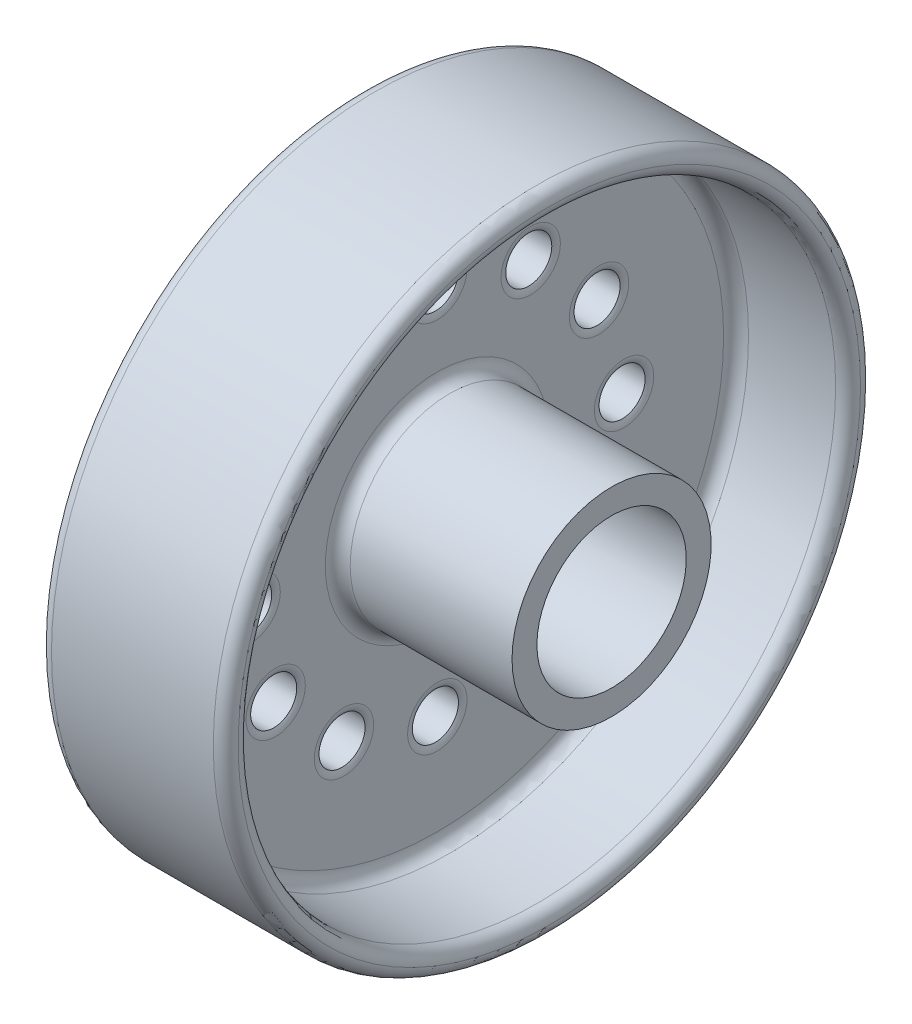
ISO-10303-21;
HEADER;
FILE_DESCRIPTION(('STEP AP214'),'2;1');
FILE_NAME('part.step','',(''),(''),'','','');
FILE_SCHEMA(('AUTOMOTIVE_DESIGN { 1 0 10303 214 1 1 1 1 }'));
ENDSEC;
DATA;
#1=APPLICATION_CONTEXT('core data for automotive mechanical design processes');
#2=APPLICATION_PROTOCOL_DEFINITION('international standard','automotive_design',2000,#1);
#3=PRODUCT_CONTEXT('',#1,'mechanical');
#4=PRODUCT('Part','Part','',(#3));
#5=PRODUCT_RELATED_PRODUCT_CATEGORY('part','',(#4));
#6=PRODUCT_DEFINITION_FORMATION('','',#4);
#7=PRODUCT_DEFINITION_CONTEXT('part definition',#1,'design');
#8=PRODUCT_DEFINITION('design','',#6,#7);
#9=PRODUCT_DEFINITION_SHAPE('','',#8);
#10=(LENGTH_UNIT() NAMED_UNIT(*) SI_UNIT(.MILLI.,.METRE.));
#11=(NAMED_UNIT(*) PLANE_ANGLE_UNIT() SI_UNIT($,.RADIAN.));
#12=(NAMED_UNIT(*) SI_UNIT($,.STERADIAN.) SOLID_ANGLE_UNIT());
#13=UNCERTAINTY_MEASURE_WITH_UNIT(LENGTH_MEASURE(1.E-05),#10,'distance_accuracy_value','');
#14=(GEOMETRIC_REPRESENTATION_CONTEXT(3) GLOBAL_UNCERTAINTY_ASSIGNED_CONTEXT((#13)) GLOBAL_UNIT_ASSIGNED_CONTEXT((#10,
#11,#12)) REPRESENTATION_CONTEXT('',''));
#15=CARTESIAN_POINT('',(0.,0.,0.));
#16=DIRECTION('',(0.,0.,1.));
#17=DIRECTION('',(1.,0.,0.));
#18=AXIS2_PLACEMENT_3D('',#15,#16,#17);
#19=CARTESIAN_POINT('',(0.,0.,0.));
#20=DIRECTION('',(-1.,0.,0.));
#21=DIRECTION('',(0.,0.,1.));
#22=AXIS2_PLACEMENT_3D('',#19,#20,#21);
#23=CYLINDRICAL_SURFACE('',#22,130.);
#24=CARTESIAN_POINT('',(5.,0.,0.));
#25=DIRECTION('',(-1.,0.,0.));
#26=DIRECTION('',(0.,0.,1.));
#27=AXIS2_PLACEMENT_3D('',#24,#25,#26);
#28=CIRCLE('',#27,130.);
#29=CARTESIAN_POINT('',(5.,0.,130.));
#30=VERTEX_POINT('',#29);
#31=EDGE_CURVE('E10',#30,#30,#28,.F.);
#32=ORIENTED_EDGE('',*,*,#31,.T.);
#33=EDGE_LOOP('',(#32));
#34=FACE_BOUND('',#33,.T.);
#35=CARTESIAN_POINT('',(70.,0.,0.));
#36=DIRECTION('',(1.,0.,0.));
#37=DIRECTION('',(0.,0.,-1.));
#38=AXIS2_PLACEMENT_3D('',#35,#36,#37);
#39=CIRCLE('',#38,130.);
#40=CARTESIAN_POINT('',(70.,0.,-130.));
#41=VERTEX_POINT('',#40);
#42=EDGE_CURVE('E50',#41,#41,#39,.F.);
#43=ORIENTED_EDGE('',*,*,#42,.T.);
#44=EDGE_LOOP('',(#43));
#45=FACE_BOUND('',#44,.T.);
#46=ADVANCED_FACE('F41',(#34,#45),#23,.T.);
#47=CARTESIAN_POINT('',(0.,0.,0.));
#48=DIRECTION('',(-1.,0.,0.));
#49=DIRECTION('',(0.,0.,1.));
#50=AXIS2_PLACEMENT_3D('',#47,#48,#49);
#51=PLANE('',#50);
#52=CARTESIAN_POINT('',(0.,0.,0.));
#53=DIRECTION('',(-1.,0.,0.));
#54=DIRECTION('',(0.,0.,1.));
#55=AXIS2_PLACEMENT_3D('',#52,#53,#54);
#56=CIRCLE('',#55,125.);
#57=CARTESIAN_POINT('',(0.,0.,125.));
#58=VERTEX_POINT('',#57);
#59=EDGE_CURVE('E55',#58,#58,#56,.T.);
#60=ORIENTED_EDGE('',*,*,#59,.T.);
#61=EDGE_LOOP('',(#60));
#62=FACE_BOUND('',#61,.T.);
#63=CARTESIAN_POINT('',(0.,64.9519052838334,37.4999999999992));
#64=DIRECTION('',(1.,0.,0.));
#65=DIRECTION('',(0.,0.,-1.));
#66=AXIS2_PLACEMENT_3D('',#63,#64,#65);
#67=CIRCLE('',#66,9.24999999999999);
#68=CARTESIAN_POINT('',(0.,64.9519052838334,28.2499999999992));
#69=VERTEX_POINT('',#68);
#70=EDGE_CURVE('E229',#69,#69,#67,.T.);
#71=ORIENTED_EDGE('',*,*,#70,.T.);
#72=EDGE_LOOP('',(#71));
#73=FACE_BOUND('',#72,.T.);
#74=CARTESIAN_POINT('',(0.,37.5000000000008,64.9519052838325));
#75=DIRECTION('',(1.,0.,0.));
#76=DIRECTION('',(0.,0.,-1.));
#77=AXIS2_PLACEMENT_3D('',#74,#75,#76);
#78=CIRCLE('',#77,9.24999999999999);
#79=CARTESIAN_POINT('',(0.,37.5000000000008,55.7019052838325));
#80=VERTEX_POINT('',#79);
#81=EDGE_CURVE('E221',#80,#80,#78,.T.);
#82=ORIENTED_EDGE('',*,*,#81,.T.);
#83=EDGE_LOOP('',(#82));
#84=FACE_BOUND('',#83,.T.);
#85=CARTESIAN_POINT('',(0.,7.85583301239705E-13,75.));
#86=DIRECTION('',(1.,0.,0.));
#87=DIRECTION('',(0.,0.,-1.));
#88=AXIS2_PLACEMENT_3D('',#85,#86,#87);
#89=CIRCLE('',#88,9.24999999999999);
#90=CARTESIAN_POINT('',(0.,7.85583301239705E-13,65.75));
#91=VERTEX_POINT('',#90);
#92=EDGE_CURVE('E213',#91,#91,#89,.T.);
#93=ORIENTED_EDGE('',*,*,#92,.T.);
#94=EDGE_LOOP('',(#93));
#95=FACE_BOUND('',#94,.T.);
#96=CARTESIAN_POINT('',(0.,-37.4999999999994,64.9519052838332));
#97=DIRECTION('',(1.,0.,0.));
#98=DIRECTION('',(0.,0.,-1.));
#99=AXIS2_PLACEMENT_3D('',#96,#97,#98);
#100=CIRCLE('',#99,9.24999999999999);
#101=CARTESIAN_POINT('',(0.,-37.4999999999994,55.7019052838332));
#102=VERTEX_POINT('',#101);
#103=EDGE_CURVE('E205',#102,#102,#100,.T.);
#104=ORIENTED_EDGE('',*,*,#103,.T.);
#105=EDGE_LOOP('',(#104));
#106=FACE_BOUND('',#105,.T.);
#107=CARTESIAN_POINT('',(0.,-64.9519052838326,37.5000000000005));
#108=DIRECTION('',(1.,0.,0.));
#109=DIRECTION('',(0.,0.,-1.));
#110=AXIS2_PLACEMENT_3D('',#107,#108,#109);
#111=CIRCLE('',#110,9.24999999999999);
#112=CARTESIAN_POINT('',(0.,-64.9519052838326,28.2500000000005));
#113=VERTEX_POINT('',#112);
#114=EDGE_CURVE('E197',#113,#113,#111,.T.);
#115=ORIENTED_EDGE('',*,*,#114,.T.);
#116=EDGE_LOOP('',(#115));
#117=FACE_BOUND('',#116,.T.);
#118=CARTESIAN_POINT('',(0.,-75.,0.));
#119=DIRECTION('',(1.,0.,0.));
#120=DIRECTION('',(0.,0.,-1.));
#121=AXIS2_PLACEMENT_3D('',#118,#119,#120);
#122=CIRCLE('',#121,9.24999999999999);
#123=CARTESIAN_POINT('',(0.,-75.,-9.24999999999999));
#124=VERTEX_POINT('',#123);
#125=EDGE_CURVE('E189',#124,#124,#122,.T.);
#126=ORIENTED_EDGE('',*,*,#125,.T.);
#127=EDGE_LOOP('',(#126));
#128=FACE_BOUND('',#127,.T.);
#129=CARTESIAN_POINT('',(0.,-64.9519052838331,-37.4999999999996));
#130=DIRECTION('',(1.,0.,0.));
#131=DIRECTION('',(0.,0.,-1.));
#132=AXIS2_PLACEMENT_3D('',#129,#130,#131);
#133=CIRCLE('',#132,9.24999999999999);
#134=CARTESIAN_POINT('',(0.,-64.9519052838331,-46.7499999999996));
#135=VERTEX_POINT('',#134);
#136=EDGE_CURVE('E181',#135,#135,#133,.T.);
#137=ORIENTED_EDGE('',*,*,#136,.T.);
#138=EDGE_LOOP('',(#137));
#139=FACE_BOUND('',#138,.T.);
#140=CARTESIAN_POINT('',(0.,-37.5000000000003,-64.9519052838327));
#141=DIRECTION('',(1.,0.,0.));
#142=DIRECTION('',(0.,0.,-1.));
#143=AXIS2_PLACEMENT_3D('',#140,#141,#142);
#144=CIRCLE('',#143,9.24999999999999);
#145=CARTESIAN_POINT('',(0.,-37.5000000000003,-74.2019052838327));
#146=VERTEX_POINT('',#145);
#147=EDGE_CURVE('E173',#146,#146,#144,.T.);
#148=ORIENTED_EDGE('',*,*,#147,.T.);
#149=EDGE_LOOP('',(#148));
#150=FACE_BOUND('',#149,.T.);
#151=CARTESIAN_POINT('',(0.,-2.61861100413235E-13,-75.));
#152=DIRECTION('',(1.,0.,0.));
#153=DIRECTION('',(0.,0.,-1.));
#154=AXIS2_PLACEMENT_3D('',#151,#152,#153);
#155=CIRCLE('',#154,9.24999999999999);
#156=CARTESIAN_POINT('',(0.,-2.61861100413235E-13,-84.25));
#157=VERTEX_POINT('',#156);
#158=EDGE_CURVE('E165',#157,#157,#155,.T.);
#159=ORIENTED_EDGE('',*,*,#158,.T.);
#160=EDGE_LOOP('',(#159));
#161=FACE_BOUND('',#160,.T.);
#162=CARTESIAN_POINT('',(0.,37.4999999999998,-64.951905283833));
#163=DIRECTION('',(1.,0.,0.));
#164=DIRECTION('',(0.,0.,-1.));
#165=AXIS2_PLACEMENT_3D('',#162,#163,#164);
#166=CIRCLE('',#165,9.24999999999999);
#167=CARTESIAN_POINT('',(0.,37.4999999999998,-74.201905283833));
#168=VERTEX_POINT('',#167);
#169=EDGE_CURVE('E157',#168,#168,#166,.T.);
#170=ORIENTED_EDGE('',*,*,#169,.T.);
#171=EDGE_LOOP('',(#170));
#172=FACE_BOUND('',#171,.T.);
#173=CARTESIAN_POINT('',(0.,64.9519052838328,-37.5000000000001));
#174=DIRECTION('',(1.,0.,0.));
#175=DIRECTION('',(0.,0.,-1.));
#176=AXIS2_PLACEMENT_3D('',#173,#174,#175);
#177=CIRCLE('',#176,9.24999999999999);
#178=CARTESIAN_POINT('',(0.,64.9519052838328,-46.7500000000001));
#179=VERTEX_POINT('',#178);
#180=EDGE_CURVE('E149',#179,#179,#177,.T.);
#181=ORIENTED_EDGE('',*,*,#180,.T.);
#182=EDGE_LOOP('',(#181));
#183=FACE_BOUND('',#182,.T.);
#184=CARTESIAN_POINT('',(0.,75.,0.));
#185=DIRECTION('',(1.,0.,0.));
#186=DIRECTION('',(0.,0.,-1.));
#187=AXIS2_PLACEMENT_3D('',#184,#185,#186);
#188=CIRCLE('',#187,9.24999999999999);
#189=CARTESIAN_POINT('',(0.,75.,-9.24999999999999));
#190=VERTEX_POINT('',#189);
#191=EDGE_CURVE('E141',#190,#190,#188,.T.);
#192=ORIENTED_EDGE('',*,*,#191,.T.);
#193=EDGE_LOOP('',(#192));
#194=FACE_BOUND('',#193,.T.);
#195=CARTESIAN_POINT('',(0.,0.,0.));
#196=DIRECTION('',(-1.,0.,0.));
#197=DIRECTION('',(0.,0.,1.));
#198=AXIS2_PLACEMENT_3D('',#195,#196,#197);
#199=CIRCLE('',#198,30.);
#200=CARTESIAN_POINT('',(0.,0.,30.));
#201=VERTEX_POINT('',#200);
#202=EDGE_CURVE('E137',#201,#201,#199,.T.);
#203=ORIENTED_EDGE('',*,*,#202,.F.);
#204=EDGE_LOOP('',(#203));
#205=FACE_BOUND('',#204,.T.);
#206=ADVANCED_FACE('F256',(#62,#73,#84,#95,#106,#117,#128,#139,#150,#161,#172,#183,#194,#205),
#51,.T.);
#207=CARTESIAN_POINT('',(0.,0.,0.));
#208=DIRECTION('',(-1.,0.,0.));
#209=DIRECTION('',(0.,0.,1.));
#210=AXIS2_PLACEMENT_3D('',#207,#208,#209);
#211=CYLINDRICAL_SURFACE('',#210,30.);
#212=ORIENTED_EDGE('',*,*,#202,.T.);
#213=EDGE_LOOP('',(#212));
#214=FACE_BOUND('',#213,.T.);
#215=CARTESIAN_POINT('',(100.,0.,0.));
#216=DIRECTION('',(-1.,0.,0.));
#217=DIRECTION('',(0.,0.,1.));
#218=AXIS2_PLACEMENT_3D('',#215,#216,#217);
#219=CIRCLE('',#218,30.);
#220=CARTESIAN_POINT('',(100.,0.,30.));
#221=VERTEX_POINT('',#220);
#222=EDGE_CURVE('E129',#221,#221,#219,.T.);
#223=ORIENTED_EDGE('',*,*,#222,.F.);
#224=EDGE_LOOP('',(#223));
#225=FACE_BOUND('',#224,.T.);
#226=ADVANCED_FACE('F258',(#214,#225),#211,.F.);
#227=CARTESIAN_POINT('',(0.,0.,0.));
#228=DIRECTION('',(-1.,0.,0.));
#229=DIRECTION('',(0.,0.,1.));
#230=AXIS2_PLACEMENT_3D('',#227,#228,#229);
#231=CYLINDRICAL_SURFACE('',#230,120.);
#232=CARTESIAN_POINT('',(35.,0.,0.));
#233=DIRECTION('',(1.,0.,0.));
#234=DIRECTION('',(0.,0.,-1.));
#235=AXIS2_PLACEMENT_3D('',#232,#233,#234);
#236=CIRCLE('',#235,120.);
#237=CARTESIAN_POINT('',(35.,0.,-120.));
#238=VERTEX_POINT('',#237);
#239=EDGE_CURVE('E121',#238,#238,#236,.F.);
#240=ORIENTED_EDGE('',*,*,#239,.T.);
#241=EDGE_LOOP('',(#240));
#242=FACE_BOUND('',#241,.T.);
#243=CARTESIAN_POINT('',(70.,0.,0.));
#244=DIRECTION('',(1.,0.,0.));
#245=DIRECTION('',(0.,0.,-1.));
#246=AXIS2_PLACEMENT_3D('',#243,#244,#245);
#247=CIRCLE('',#246,120.);
#248=CARTESIAN_POINT('',(70.,0.,-120.));
#249=VERTEX_POINT('',#248);
#250=EDGE_CURVE('E125',#249,#249,#247,.T.);
#251=ORIENTED_EDGE('',*,*,#250,.T.);
#252=EDGE_LOOP('',(#251));
#253=FACE_BOUND('',#252,.T.);
#254=ADVANCED_FACE('F265',(#242,#253),#231,.F.);
#255=CARTESIAN_POINT('',(30.,0.,0.));
#256=DIRECTION('',(1.,0.,0.));
#257=DIRECTION('',(0.,0.,-1.));
#258=AXIS2_PLACEMENT_3D('',#255,#256,#257);
#259=PLANE('',#258);
#260=CARTESIAN_POINT('',(30.,0.,0.));
#261=DIRECTION('',(1.,0.,0.));
#262=DIRECTION('',(0.,0.,-1.));
#263=AXIS2_PLACEMENT_3D('',#260,#261,#262);
#264=CIRCLE('',#263,115.);
#265=CARTESIAN_POINT('',(30.,0.,-115.));
#266=VERTEX_POINT('',#265);
#267=EDGE_CURVE('E65',#266,#266,#264,.T.);
#268=ORIENTED_EDGE('',*,*,#267,.T.);
#269=EDGE_LOOP('',(#268));
#270=FACE_BOUND('',#269,.T.);
#271=CARTESIAN_POINT('',(30.,0.,0.));
#272=DIRECTION('',(1.,0.,0.));
#273=DIRECTION('',(0.,0.,-1.));
#274=AXIS2_PLACEMENT_3D('',#271,#272,#273);
#275=CIRCLE('',#274,45.);
#276=CARTESIAN_POINT('',(30.,0.,-45.));
#277=VERTEX_POINT('',#276);
#278=EDGE_CURVE('E69',#277,#277,#275,.F.);
#279=ORIENTED_EDGE('',*,*,#278,.T.);
#280=EDGE_LOOP('',(#279));
#281=FACE_BOUND('',#280,.T.);
#282=CARTESIAN_POINT('',(30.,75.,0.));
#283=DIRECTION('',(1.,0.,0.));
#284=DIRECTION('',(0.,0.,-1.));
#285=AXIS2_PLACEMENT_3D('',#282,#283,#284);
#286=CIRCLE('',#285,11.9238315204964);
#287=CARTESIAN_POINT('',(30.,75.,-11.9238315204964));
#288=VERTEX_POINT('',#287);
#289=EDGE_CURVE('E73',#288,#288,#286,.F.);
#290=ORIENTED_EDGE('',*,*,#289,.T.);
#291=EDGE_LOOP('',(#290));
#292=FACE_BOUND('',#291,.T.);
#293=CARTESIAN_POINT('',(30.,64.9519052838328,-37.5000000000001));
#294=DIRECTION('',(1.,0.,0.));
#295=DIRECTION('',(0.,0.,-1.));
#296=AXIS2_PLACEMENT_3D('',#293,#294,#295);
#297=CIRCLE('',#296,11.9238315204964);
#298=CARTESIAN_POINT('',(30.,64.9519052838328,-49.4238315204964));
#299=VERTEX_POINT('',#298);
#300=EDGE_CURVE('E77',#299,#299,#297,.F.);
#301=ORIENTED_EDGE('',*,*,#300,.T.);
#302=EDGE_LOOP('',(#301));
#303=FACE_BOUND('',#302,.T.);
#304=CARTESIAN_POINT('',(30.,37.4999999999998,-64.951905283833));
#305=DIRECTION('',(1.,0.,0.));
#306=DIRECTION('',(0.,0.,-1.));
#307=AXIS2_PLACEMENT_3D('',#304,#305,#306);
#308=CIRCLE('',#307,11.9238315204964);
#309=CARTESIAN_POINT('',(30.,37.4999999999998,-76.8757368043294));
#310=VERTEX_POINT('',#309);
#311=EDGE_CURVE('E81',#310,#310,#308,.F.);
#312=ORIENTED_EDGE('',*,*,#311,.T.);
#313=EDGE_LOOP('',(#312));
#314=FACE_BOUND('',#313,.T.);
#315=CARTESIAN_POINT('',(30.,-2.61861100413235E-13,-75.));
#316=DIRECTION('',(1.,0.,0.));
#317=DIRECTION('',(0.,0.,-1.));
#318=AXIS2_PLACEMENT_3D('',#315,#316,#317);
#319=CIRCLE('',#318,11.9238315204964);
#320=CARTESIAN_POINT('',(30.,-2.61861100413235E-13,-86.9238315204964));
#321=VERTEX_POINT('',#320);
#322=EDGE_CURVE('E85',#321,#321,#319,.F.);
#323=ORIENTED_EDGE('',*,*,#322,.T.);
#324=EDGE_LOOP('',(#323));
#325=FACE_BOUND('',#324,.T.);
#326=CARTESIAN_POINT('',(30.,-37.5000000000003,-64.9519052838327));
#327=DIRECTION('',(1.,0.,0.));
#328=DIRECTION('',(0.,0.,-1.));
#329=AXIS2_PLACEMENT_3D('',#326,#327,#328);
#330=CIRCLE('',#329,11.9238315204964);
#331=CARTESIAN_POINT('',(30.,-37.5000000000003,-76.8757368043291));
#332=VERTEX_POINT('',#331);
#333=EDGE_CURVE('E89',#332,#332,#330,.F.);
#334=ORIENTED_EDGE('',*,*,#333,.T.);
#335=EDGE_LOOP('',(#334));
#336=FACE_BOUND('',#335,.T.);
#337=CARTESIAN_POINT('',(30.,-64.9519052838331,-37.4999999999996));
#338=DIRECTION('',(1.,0.,0.));
#339=DIRECTION('',(0.,0.,-1.));
#340=AXIS2_PLACEMENT_3D('',#337,#338,#339);
#341=CIRCLE('',#340,11.9238315204964);
#342=CARTESIAN_POINT('',(30.,-64.9519052838331,-49.423831520496));
#343=VERTEX_POINT('',#342);
#344=EDGE_CURVE('E93',#343,#343,#341,.F.);
#345=ORIENTED_EDGE('',*,*,#344,.T.);
#346=EDGE_LOOP('',(#345));
#347=FACE_BOUND('',#346,.T.);
#348=CARTESIAN_POINT('',(30.,-75.,0.));
#349=DIRECTION('',(1.,0.,0.));
#350=DIRECTION('',(0.,0.,-1.));
#351=AXIS2_PLACEMENT_3D('',#348,#349,#350);
#352=CIRCLE('',#351,11.9238315204964);
#353=CARTESIAN_POINT('',(30.,-75.,-11.9238315204964));
#354=VERTEX_POINT('',#353);
#355=EDGE_CURVE('E97',#354,#354,#352,.F.);
#356=ORIENTED_EDGE('',*,*,#355,.T.);
#357=EDGE_LOOP('',(#356));
#358=FACE_BOUND('',#357,.T.);
#359=CARTESIAN_POINT('',(30.,-64.9519052838326,37.5000000000005));
#360=DIRECTION('',(1.,0.,0.));
#361=DIRECTION('',(0.,0.,-1.));
#362=AXIS2_PLACEMENT_3D('',#359,#360,#361);
#363=CIRCLE('',#362,11.9238315204964);
#364=CARTESIAN_POINT('',(30.,-64.9519052838326,25.5761684795041));
#365=VERTEX_POINT('',#364);
#366=EDGE_CURVE('E101',#365,#365,#363,.F.);
#367=ORIENTED_EDGE('',*,*,#366,.T.);
#368=EDGE_LOOP('',(#367));
#369=FACE_BOUND('',#368,.T.);
#370=CARTESIAN_POINT('',(30.,-37.4999999999994,64.9519052838332));
#371=DIRECTION('',(1.,0.,0.));
#372=DIRECTION('',(0.,0.,-1.));
#373=AXIS2_PLACEMENT_3D('',#370,#371,#372);
#374=CIRCLE('',#373,11.9238315204964);
#375=CARTESIAN_POINT('',(30.,-37.4999999999994,53.0280737633369));
#376=VERTEX_POINT('',#375);
#377=EDGE_CURVE('E105',#376,#376,#374,.F.);
#378=ORIENTED_EDGE('',*,*,#377,.T.);
#379=EDGE_LOOP('',(#378));
#380=FACE_BOUND('',#379,.T.);
#381=CARTESIAN_POINT('',(30.,7.85583301239705E-13,75.));
#382=DIRECTION('',(1.,0.,0.));
#383=DIRECTION('',(0.,0.,-1.));
#384=AXIS2_PLACEMENT_3D('',#381,#382,#383);
#385=CIRCLE('',#384,11.9238315204964);
#386=CARTESIAN_POINT('',(30.,7.85583301239705E-13,63.0761684795036));
#387=VERTEX_POINT('',#386);
#388=EDGE_CURVE('E109',#387,#387,#385,.F.);
#389=ORIENTED_EDGE('',*,*,#388,.T.);
#390=EDGE_LOOP('',(#389));
#391=FACE_BOUND('',#390,.T.);
#392=CARTESIAN_POINT('',(30.,37.5000000000008,64.9519052838325));
#393=DIRECTION('',(1.,0.,0.));
#394=DIRECTION('',(0.,0.,-1.));
#395=AXIS2_PLACEMENT_3D('',#392,#393,#394);
#396=CIRCLE('',#395,11.9238315204964);
#397=CARTESIAN_POINT('',(30.,37.5000000000008,53.0280737633361));
#398=VERTEX_POINT('',#397);
#399=EDGE_CURVE('E113',#398,#398,#396,.F.);
#400=ORIENTED_EDGE('',*,*,#399,.T.);
#401=EDGE_LOOP('',(#400));
#402=FACE_BOUND('',#401,.T.);
#403=CARTESIAN_POINT('',(30.,64.9519052838334,37.4999999999992));
#404=DIRECTION('',(1.,0.,0.));
#405=DIRECTION('',(0.,0.,-1.));
#406=AXIS2_PLACEMENT_3D('',#403,#404,#405);
#407=CIRCLE('',#406,11.9238315204964);
#408=CARTESIAN_POINT('',(30.,64.9519052838334,25.5761684795028));
#409=VERTEX_POINT('',#408);
#410=EDGE_CURVE('E117',#409,#409,#407,.F.);
#411=ORIENTED_EDGE('',*,*,#410,.T.);
#412=EDGE_LOOP('',(#411));
#413=FACE_BOUND('',#412,.T.);
#414=ADVANCED_FACE('F276',(#270,#281,#292,#303,#314,#325,#336,#347,#358,#369,#380,#391,#402,
#413),#259,.T.);
#415=CARTESIAN_POINT('',(0.,0.,0.));
#416=DIRECTION('',(-1.,0.,0.));
#417=DIRECTION('',(0.,0.,1.));
#418=AXIS2_PLACEMENT_3D('',#415,#416,#417);
#419=CYLINDRICAL_SURFACE('',#418,40.);
#420=CARTESIAN_POINT('',(35.,0.,0.));
#421=DIRECTION('',(1.,0.,0.));
#422=DIRECTION('',(0.,0.,-1.));
#423=AXIS2_PLACEMENT_3D('',#420,#421,#422);
#424=CIRCLE('',#423,40.);
#425=CARTESIAN_POINT('',(35.,0.,-40.));
#426=VERTEX_POINT('',#425);
#427=EDGE_CURVE('E61',#426,#426,#424,.T.);
#428=ORIENTED_EDGE('',*,*,#427,.T.);
#429=EDGE_LOOP('',(#428));
#430=FACE_BOUND('',#429,.T.);
#431=CARTESIAN_POINT('',(100.,0.,0.));
#432=DIRECTION('',(-1.,0.,0.));
#433=DIRECTION('',(0.,0.,1.));
#434=AXIS2_PLACEMENT_3D('',#431,#432,#433);
#435=CIRCLE('',#434,40.);
#436=CARTESIAN_POINT('',(100.,0.,40.));
#437=VERTEX_POINT('',#436);
#438=EDGE_CURVE('E133',#437,#437,#435,.T.);
#439=ORIENTED_EDGE('',*,*,#438,.T.);
#440=EDGE_LOOP('',(#439));
#441=FACE_BOUND('',#440,.T.);
#442=ADVANCED_FACE('F280',(#430,#441),#419,.T.);
#443=CARTESIAN_POINT('',(100.,0.,0.));
#444=DIRECTION('',(1.,0.,0.));
#445=DIRECTION('',(0.,0.,-1.));
#446=AXIS2_PLACEMENT_3D('',#443,#444,#445);
#447=PLANE('',#446);
#448=ORIENTED_EDGE('',*,*,#222,.T.);
#449=EDGE_LOOP('',(#448));
#450=FACE_BOUND('',#449,.T.);
#451=ORIENTED_EDGE('',*,*,#438,.F.);
#452=EDGE_LOOP('',(#451));
#453=FACE_BOUND('',#452,.T.);
#454=ADVANCED_FACE('F284',(#450,#453),#447,.T.);
#455=CARTESIAN_POINT('',(30.,75.,0.));
#456=DIRECTION('',(1.,0.,0.));
#457=DIRECTION('',(0.,0.,-1.));
#458=AXIS2_PLACEMENT_3D('',#455,#456,#457);
#459=CYLINDRICAL_SURFACE('',#458,9.24999999999999);
#460=ORIENTED_EDGE('',*,*,#191,.F.);
#461=EDGE_LOOP('',(#460));
#462=FACE_BOUND('',#461,.T.);
#463=CARTESIAN_POINT('',(29.225,75.,0.));
#464=DIRECTION('',(1.,0.,0.));
#465=DIRECTION('',(0.,0.,-1.));
#466=AXIS2_PLACEMENT_3D('',#463,#464,#465);
#467=CIRCLE('',#466,9.24999999999999);
#468=CARTESIAN_POINT('',(29.225,75.,-9.24999999999999));
#469=VERTEX_POINT('',#468);
#470=EDGE_CURVE('E145',#469,#469,#467,.T.);
#471=ORIENTED_EDGE('',*,*,#470,.T.);
#472=EDGE_LOOP('',(#471));
#473=FACE_BOUND('',#472,.T.);
#474=ADVANCED_FACE('F271',(#462,#473),#459,.F.);
#475=CARTESIAN_POINT('',(30.,64.9519052838328,-37.5000000000001));
#476=DIRECTION('',(1.,0.,0.));
#477=DIRECTION('',(0.,0.,-1.));
#478=AXIS2_PLACEMENT_3D('',#475,#476,#477);
#479=CYLINDRICAL_SURFACE('',#478,9.24999999999999);
#480=ORIENTED_EDGE('',*,*,#180,.F.);
#481=EDGE_LOOP('',(#480));
#482=FACE_BOUND('',#481,.T.);
#483=CARTESIAN_POINT('',(29.225,64.9519052838328,-37.5000000000001));
#484=DIRECTION('',(1.,0.,0.));
#485=DIRECTION('',(0.,0.,-1.));
#486=AXIS2_PLACEMENT_3D('',#483,#484,#485);
#487=CIRCLE('',#486,9.24999999999999);
#488=CARTESIAN_POINT('',(29.225,64.9519052838328,-46.7500000000001));
#489=VERTEX_POINT('',#488);
#490=EDGE_CURVE('E153',#489,#489,#487,.T.);
#491=ORIENTED_EDGE('',*,*,#490,.T.);
#492=EDGE_LOOP('',(#491));
#493=FACE_BOUND('',#492,.T.);
#494=ADVANCED_FACE('F533',(#482,#493),#479,.F.);
#495=CARTESIAN_POINT('',(30.,37.4999999999998,-64.951905283833));
#496=DIRECTION('',(1.,0.,0.));
#497=DIRECTION('',(0.,0.,-1.));
#498=AXIS2_PLACEMENT_3D('',#495,#496,#497);
#499=CYLINDRICAL_SURFACE('',#498,9.24999999999999);
#500=ORIENTED_EDGE('',*,*,#169,.F.);
#501=EDGE_LOOP('',(#500));
#502=FACE_BOUND('',#501,.T.);
#503=CARTESIAN_POINT('',(29.225,37.4999999999998,-64.951905283833));
#504=DIRECTION('',(1.,0.,0.));
#505=DIRECTION('',(0.,0.,-1.));
#506=AXIS2_PLACEMENT_3D('',#503,#504,#505);
#507=CIRCLE('',#506,9.25);
#508=CARTESIAN_POINT('',(29.225,37.4999999999998,-74.201905283833));
#509=VERTEX_POINT('',#508);
#510=EDGE_CURVE('E161',#509,#509,#507,.T.);
#511=ORIENTED_EDGE('',*,*,#510,.T.);
#512=EDGE_LOOP('',(#511));
#513=FACE_BOUND('',#512,.T.);
#514=ADVANCED_FACE('F523',(#502,#513),#499,.F.);
#515=CARTESIAN_POINT('',(30.,-2.61861100413235E-13,-75.));
#516=DIRECTION('',(1.,0.,0.));
#517=DIRECTION('',(0.,0.,-1.));
#518=AXIS2_PLACEMENT_3D('',#515,#516,#517);
#519=CYLINDRICAL_SURFACE('',#518,9.24999999999999);
#520=ORIENTED_EDGE('',*,*,#158,.F.);
#521=EDGE_LOOP('',(#520));
#522=FACE_BOUND('',#521,.T.);
#523=CARTESIAN_POINT('',(29.225,-2.61861100413235E-13,-75.));
#524=DIRECTION('',(1.,0.,0.));
#525=DIRECTION('',(0.,0.,-1.));
#526=AXIS2_PLACEMENT_3D('',#523,#524,#525);
#527=CIRCLE('',#526,9.25);
#528=CARTESIAN_POINT('',(29.225,-2.61861100413235E-13,-84.25));
#529=VERTEX_POINT('',#528);
#530=EDGE_CURVE('E169',#529,#529,#527,.T.);
#531=ORIENTED_EDGE('',*,*,#530,.T.);
#532=EDGE_LOOP('',(#531));
#533=FACE_BOUND('',#532,.T.);
#534=ADVANCED_FACE('F513',(#522,#533),#519,.F.);
#535=CARTESIAN_POINT('',(30.,-37.5000000000003,-64.9519052838327));
#536=DIRECTION('',(1.,0.,0.));
#537=DIRECTION('',(0.,0.,-1.));
#538=AXIS2_PLACEMENT_3D('',#535,#536,#537);
#539=CYLINDRICAL_SURFACE('',#538,9.24999999999999);
#540=ORIENTED_EDGE('',*,*,#147,.F.);
#541=EDGE_LOOP('',(#540));
#542=FACE_BOUND('',#541,.T.);
#543=CARTESIAN_POINT('',(29.225,-37.5000000000003,-64.9519052838327));
#544=DIRECTION('',(1.,0.,0.));
#545=DIRECTION('',(0.,0.,-1.));
#546=AXIS2_PLACEMENT_3D('',#543,#544,#545);
#547=CIRCLE('',#546,9.25);
#548=CARTESIAN_POINT('',(29.225,-37.5000000000003,-74.2019052838327));
#549=VERTEX_POINT('',#548);
#550=EDGE_CURVE('E177',#549,#549,#547,.T.);
#551=ORIENTED_EDGE('',*,*,#550,.T.);
#552=EDGE_LOOP('',(#551));
#553=FACE_BOUND('',#552,.T.);
#554=ADVANCED_FACE('F503',(#542,#553),#539,.F.);
#555=CARTESIAN_POINT('',(30.,-64.9519052838331,-37.4999999999996));
#556=DIRECTION('',(1.,0.,0.));
#557=DIRECTION('',(0.,0.,-1.));
#558=AXIS2_PLACEMENT_3D('',#555,#556,#557);
#559=CYLINDRICAL_SURFACE('',#558,9.24999999999999);
#560=ORIENTED_EDGE('',*,*,#136,.F.);
#561=EDGE_LOOP('',(#560));
#562=FACE_BOUND('',#561,.T.);
#563=CARTESIAN_POINT('',(29.225,-64.9519052838331,-37.4999999999996));
#564=DIRECTION('',(1.,0.,0.));
#565=DIRECTION('',(0.,0.,-1.));
#566=AXIS2_PLACEMENT_3D('',#563,#564,#565);
#567=CIRCLE('',#566,9.24999999999999);
#568=CARTESIAN_POINT('',(29.225,-64.9519052838331,-46.7499999999996));
#569=VERTEX_POINT('',#568);
#570=EDGE_CURVE('E185',#569,#569,#567,.T.);
#571=ORIENTED_EDGE('',*,*,#570,.T.);
#572=EDGE_LOOP('',(#571));
#573=FACE_BOUND('',#572,.T.);
#574=ADVANCED_FACE('F493',(#562,#573),#559,.F.);
#575=CARTESIAN_POINT('',(30.,-75.,0.));
#576=DIRECTION('',(1.,0.,0.));
#577=DIRECTION('',(0.,0.,-1.));
#578=AXIS2_PLACEMENT_3D('',#575,#576,#577);
#579=CYLINDRICAL_SURFACE('',#578,9.24999999999999);
#580=ORIENTED_EDGE('',*,*,#125,.F.);
#581=EDGE_LOOP('',(#580));
#582=FACE_BOUND('',#581,.T.);
#583=CARTESIAN_POINT('',(29.225,-75.,0.));
#584=DIRECTION('',(1.,0.,0.));
#585=DIRECTION('',(0.,0.,-1.));
#586=AXIS2_PLACEMENT_3D('',#583,#584,#585);
#587=CIRCLE('',#586,9.24999999999999);
#588=CARTESIAN_POINT('',(29.225,-75.,-9.24999999999999));
#589=VERTEX_POINT('',#588);
#590=EDGE_CURVE('E193',#589,#589,#587,.T.);
#591=ORIENTED_EDGE('',*,*,#590,.T.);
#592=EDGE_LOOP('',(#591));
#593=FACE_BOUND('',#592,.T.);
#594=ADVANCED_FACE('F483',(#582,#593),#579,.F.);
#595=CARTESIAN_POINT('',(30.,-64.9519052838326,37.5000000000005));
#596=DIRECTION('',(1.,0.,0.));
#597=DIRECTION('',(0.,0.,-1.));
#598=AXIS2_PLACEMENT_3D('',#595,#596,#597);
#599=CYLINDRICAL_SURFACE('',#598,9.24999999999999);
#600=ORIENTED_EDGE('',*,*,#114,.F.);
#601=EDGE_LOOP('',(#600));
#602=FACE_BOUND('',#601,.T.);
#603=CARTESIAN_POINT('',(29.225,-64.9519052838326,37.5000000000005));
#604=DIRECTION('',(1.,0.,0.));
#605=DIRECTION('',(0.,0.,-1.));
#606=AXIS2_PLACEMENT_3D('',#603,#604,#605);
#607=CIRCLE('',#606,9.24999999999999);
#608=CARTESIAN_POINT('',(29.225,-64.9519052838326,28.2500000000005));
#609=VERTEX_POINT('',#608);
#610=EDGE_CURVE('E201',#609,#609,#607,.T.);
#611=ORIENTED_EDGE('',*,*,#610,.T.);
#612=EDGE_LOOP('',(#611));
#613=FACE_BOUND('',#612,.T.);
#614=ADVANCED_FACE('F473',(#602,#613),#599,.F.);
#615=CARTESIAN_POINT('',(30.,-37.4999999999994,64.9519052838332));
#616=DIRECTION('',(1.,0.,0.));
#617=DIRECTION('',(0.,0.,-1.));
#618=AXIS2_PLACEMENT_3D('',#615,#616,#617);
#619=CYLINDRICAL_SURFACE('',#618,9.24999999999999);
#620=ORIENTED_EDGE('',*,*,#103,.F.);
#621=EDGE_LOOP('',(#620));
#622=FACE_BOUND('',#621,.T.);
#623=CARTESIAN_POINT('',(29.225,-37.4999999999994,64.9519052838332));
#624=DIRECTION('',(1.,0.,0.));
#625=DIRECTION('',(0.,0.,-1.));
#626=AXIS2_PLACEMENT_3D('',#623,#624,#625);
#627=CIRCLE('',#626,9.25);
#628=CARTESIAN_POINT('',(29.225,-37.4999999999994,55.7019052838332));
#629=VERTEX_POINT('',#628);
#630=EDGE_CURVE('E209',#629,#629,#627,.T.);
#631=ORIENTED_EDGE('',*,*,#630,.T.);
#632=EDGE_LOOP('',(#631));
#633=FACE_BOUND('',#632,.T.);
#634=ADVANCED_FACE('F463',(#622,#633),#619,.F.);
#635=CARTESIAN_POINT('',(30.,7.85583301239705E-13,75.));
#636=DIRECTION('',(1.,0.,0.));
#637=DIRECTION('',(0.,0.,-1.));
#638=AXIS2_PLACEMENT_3D('',#635,#636,#637);
#639=CYLINDRICAL_SURFACE('',#638,9.24999999999999);
#640=ORIENTED_EDGE('',*,*,#92,.F.);
#641=EDGE_LOOP('',(#640));
#642=FACE_BOUND('',#641,.T.);
#643=CARTESIAN_POINT('',(29.225,7.85583301239705E-13,75.));
#644=DIRECTION('',(1.,0.,0.));
#645=DIRECTION('',(0.,0.,-1.));
#646=AXIS2_PLACEMENT_3D('',#643,#644,#645);
#647=CIRCLE('',#646,9.25);
#648=CARTESIAN_POINT('',(29.225,7.85583301239705E-13,65.75));
#649=VERTEX_POINT('',#648);
#650=EDGE_CURVE('E217',#649,#649,#647,.T.);
#651=ORIENTED_EDGE('',*,*,#650,.T.);
#652=EDGE_LOOP('',(#651));
#653=FACE_BOUND('',#652,.T.);
#654=ADVANCED_FACE('F453',(#642,#653),#639,.F.);
#655=CARTESIAN_POINT('',(30.,37.5000000000008,64.9519052838325));
#656=DIRECTION('',(1.,0.,0.));
#657=DIRECTION('',(0.,0.,-1.));
#658=AXIS2_PLACEMENT_3D('',#655,#656,#657);
#659=CYLINDRICAL_SURFACE('',#658,9.24999999999999);
#660=ORIENTED_EDGE('',*,*,#81,.F.);
#661=EDGE_LOOP('',(#660));
#662=FACE_BOUND('',#661,.T.);
#663=CARTESIAN_POINT('',(29.225,37.5000000000008,64.9519052838325));
#664=DIRECTION('',(1.,0.,0.));
#665=DIRECTION('',(0.,0.,-1.));
#666=AXIS2_PLACEMENT_3D('',#663,#664,#665);
#667=CIRCLE('',#666,9.24999999999999);
#668=CARTESIAN_POINT('',(29.225,37.5000000000008,55.7019052838325));
#669=VERTEX_POINT('',#668);
#670=EDGE_CURVE('E225',#669,#669,#667,.T.);
#671=ORIENTED_EDGE('',*,*,#670,.T.);
#672=EDGE_LOOP('',(#671));
#673=FACE_BOUND('',#672,.T.);
#674=ADVANCED_FACE('F442',(#662,#673),#659,.F.);
#675=CARTESIAN_POINT('',(30.,64.9519052838334,37.4999999999992));
#676=DIRECTION('',(1.,0.,0.));
#677=DIRECTION('',(0.,0.,-1.));
#678=AXIS2_PLACEMENT_3D('',#675,#676,#677);
#679=CYLINDRICAL_SURFACE('',#678,9.24999999999999);
#680=ORIENTED_EDGE('',*,*,#70,.F.);
#681=EDGE_LOOP('',(#680));
#682=FACE_BOUND('',#681,.T.);
#683=CARTESIAN_POINT('',(29.225,64.9519052838334,37.4999999999992));
#684=DIRECTION('',(1.,0.,0.));
#685=DIRECTION('',(0.,0.,-1.));
#686=AXIS2_PLACEMENT_3D('',#683,#684,#685);
#687=CIRCLE('',#686,9.24999999999999);
#688=CARTESIAN_POINT('',(29.225,64.9519052838334,28.2499999999992));
#689=VERTEX_POINT('',#688);
#690=EDGE_CURVE('E233',#689,#689,#687,.T.);
#691=ORIENTED_EDGE('',*,*,#690,.T.);
#692=EDGE_LOOP('',(#691));
#693=FACE_BOUND('',#692,.T.);
#694=ADVANCED_FACE('F293',(#682,#693),#679,.F.);
#695=CARTESIAN_POINT('',(35.,0.,0.));
#696=DIRECTION('',(1.,0.,0.));
#697=DIRECTION('',(0.,0.,-1.));
#698=AXIS2_PLACEMENT_3D('',#695,#696,#697);
#699=TOROIDAL_SURFACE('',#698,115.,5.);
#700=ORIENTED_EDGE('',*,*,#267,.F.);
#701=EDGE_LOOP('',(#700));
#702=FACE_BOUND('',#701,.T.);
#703=ORIENTED_EDGE('',*,*,#239,.F.);
#704=EDGE_LOOP('',(#703));
#705=FACE_BOUND('',#704,.T.);
#706=ADVANCED_FACE('F289',(#702,#705),#699,.F.);
#707=CARTESIAN_POINT('',(35.,0.,0.));
#708=DIRECTION('',(1.,0.,0.));
#709=DIRECTION('',(0.,0.,-1.));
#710=AXIS2_PLACEMENT_3D('',#707,#708,#709);
#711=TOROIDAL_SURFACE('',#710,45.,5.);
#712=ORIENTED_EDGE('',*,*,#427,.F.);
#713=EDGE_LOOP('',(#712));
#714=FACE_BOUND('',#713,.T.);
#715=ORIENTED_EDGE('',*,*,#278,.F.);
#716=EDGE_LOOP('',(#715));
#717=FACE_BOUND('',#716,.T.);
#718=ADVANCED_FACE('F292',(#714,#717),#711,.F.);
#719=CARTESIAN_POINT('',(25.,75.,0.));
#720=DIRECTION('',(1.,0.,0.));
#721=DIRECTION('',(0.,0.,-1.));
#722=AXIS2_PLACEMENT_3D('',#719,#720,#721);
#723=TOROIDAL_SURFACE('',#722,11.9238315204964,5.);
#724=ORIENTED_EDGE('',*,*,#289,.F.);
#725=EDGE_LOOP('',(#724));
#726=FACE_BOUND('',#725,.T.);
#727=ORIENTED_EDGE('',*,*,#470,.F.);
#728=EDGE_LOOP('',(#727));
#729=FACE_BOUND('',#728,.T.);
#730=ADVANCED_FACE('F297',(#726,#729),#723,.T.);
#731=CARTESIAN_POINT('',(25.,64.9519052838328,-37.5000000000001));
#732=DIRECTION('',(1.,0.,0.));
#733=DIRECTION('',(0.,0.,-1.));
#734=AXIS2_PLACEMENT_3D('',#731,#732,#733);
#735=TOROIDAL_SURFACE('',#734,11.9238315204964,5.);
#736=ORIENTED_EDGE('',*,*,#300,.F.);
#737=EDGE_LOOP('',(#736));
#738=FACE_BOUND('',#737,.T.);
#739=ORIENTED_EDGE('',*,*,#490,.F.);
#740=EDGE_LOOP('',(#739));
#741=FACE_BOUND('',#740,.T.);
#742=ADVANCED_FACE('F301',(#738,#741),#735,.T.);
#743=CARTESIAN_POINT('',(25.,37.4999999999998,-64.951905283833));
#744=DIRECTION('',(1.,0.,0.));
#745=DIRECTION('',(0.,0.,-1.));
#746=AXIS2_PLACEMENT_3D('',#743,#744,#745);
#747=TOROIDAL_SURFACE('',#746,11.9238315204964,5.);
#748=ORIENTED_EDGE('',*,*,#311,.F.);
#749=EDGE_LOOP('',(#748));
#750=FACE_BOUND('',#749,.T.);
#751=ORIENTED_EDGE('',*,*,#510,.F.);
#752=EDGE_LOOP('',(#751));
#753=FACE_BOUND('',#752,.T.);
#754=ADVANCED_FACE('F305',(#750,#753),#747,.T.);
#755=CARTESIAN_POINT('',(25.,-2.61861100413235E-13,-75.));
#756=DIRECTION('',(1.,0.,0.));
#757=DIRECTION('',(0.,0.,-1.));
#758=AXIS2_PLACEMENT_3D('',#755,#756,#757);
#759=TOROIDAL_SURFACE('',#758,11.9238315204964,5.);
#760=ORIENTED_EDGE('',*,*,#322,.F.);
#761=EDGE_LOOP('',(#760));
#762=FACE_BOUND('',#761,.T.);
#763=ORIENTED_EDGE('',*,*,#530,.F.);
#764=EDGE_LOOP('',(#763));
#765=FACE_BOUND('',#764,.T.);
#766=ADVANCED_FACE('F309',(#762,#765),#759,.T.);
#767=CARTESIAN_POINT('',(25.,-37.5000000000003,-64.9519052838327));
#768=DIRECTION('',(1.,0.,0.));
#769=DIRECTION('',(0.,0.,-1.));
#770=AXIS2_PLACEMENT_3D('',#767,#768,#769);
#771=TOROIDAL_SURFACE('',#770,11.9238315204964,5.);
#772=ORIENTED_EDGE('',*,*,#333,.F.);
#773=EDGE_LOOP('',(#772));
#774=FACE_BOUND('',#773,.T.);
#775=ORIENTED_EDGE('',*,*,#550,.F.);
#776=EDGE_LOOP('',(#775));
#777=FACE_BOUND('',#776,.T.);
#778=ADVANCED_FACE('F313',(#774,#777),#771,.T.);
#779=CARTESIAN_POINT('',(25.,-64.9519052838331,-37.4999999999996));
#780=DIRECTION('',(1.,0.,0.));
#781=DIRECTION('',(0.,0.,-1.));
#782=AXIS2_PLACEMENT_3D('',#779,#780,#781);
#783=TOROIDAL_SURFACE('',#782,11.9238315204964,5.);
#784=ORIENTED_EDGE('',*,*,#344,.F.);
#785=EDGE_LOOP('',(#784));
#786=FACE_BOUND('',#785,.T.);
#787=ORIENTED_EDGE('',*,*,#570,.F.);
#788=EDGE_LOOP('',(#787));
#789=FACE_BOUND('',#788,.T.);
#790=ADVANCED_FACE('F317',(#786,#789),#783,.T.);
#791=CARTESIAN_POINT('',(25.,-75.,0.));
#792=DIRECTION('',(1.,0.,0.));
#793=DIRECTION('',(0.,0.,-1.));
#794=AXIS2_PLACEMENT_3D('',#791,#792,#793);
#795=TOROIDAL_SURFACE('',#794,11.9238315204964,5.);
#796=ORIENTED_EDGE('',*,*,#355,.F.);
#797=EDGE_LOOP('',(#796));
#798=FACE_BOUND('',#797,.T.);
#799=ORIENTED_EDGE('',*,*,#590,.F.);
#800=EDGE_LOOP('',(#799));
#801=FACE_BOUND('',#800,.T.);
#802=ADVANCED_FACE('F321',(#798,#801),#795,.T.);
#803=CARTESIAN_POINT('',(25.,-64.9519052838326,37.5000000000005));
#804=DIRECTION('',(1.,0.,0.));
#805=DIRECTION('',(0.,0.,-1.));
#806=AXIS2_PLACEMENT_3D('',#803,#804,#805);
#807=TOROIDAL_SURFACE('',#806,11.9238315204964,5.);
#808=ORIENTED_EDGE('',*,*,#366,.F.);
#809=EDGE_LOOP('',(#808));
#810=FACE_BOUND('',#809,.T.);
#811=ORIENTED_EDGE('',*,*,#610,.F.);
#812=EDGE_LOOP('',(#811));
#813=FACE_BOUND('',#812,.T.);
#814=ADVANCED_FACE('F325',(#810,#813),#807,.T.);
#815=CARTESIAN_POINT('',(25.,-37.4999999999994,64.9519052838332));
#816=DIRECTION('',(1.,0.,0.));
#817=DIRECTION('',(0.,0.,-1.));
#818=AXIS2_PLACEMENT_3D('',#815,#816,#817);
#819=TOROIDAL_SURFACE('',#818,11.9238315204964,5.);
#820=ORIENTED_EDGE('',*,*,#377,.F.);
#821=EDGE_LOOP('',(#820));
#822=FACE_BOUND('',#821,.T.);
#823=ORIENTED_EDGE('',*,*,#630,.F.);
#824=EDGE_LOOP('',(#823));
#825=FACE_BOUND('',#824,.T.);
#826=ADVANCED_FACE('F329',(#822,#825),#819,.T.);
#827=CARTESIAN_POINT('',(25.,7.85583301239705E-13,75.));
#828=DIRECTION('',(1.,0.,0.));
#829=DIRECTION('',(0.,0.,-1.));
#830=AXIS2_PLACEMENT_3D('',#827,#828,#829);
#831=TOROIDAL_SURFACE('',#830,11.9238315204964,5.);
#832=ORIENTED_EDGE('',*,*,#388,.F.);
#833=EDGE_LOOP('',(#832));
#834=FACE_BOUND('',#833,.T.);
#835=ORIENTED_EDGE('',*,*,#650,.F.);
#836=EDGE_LOOP('',(#835));
#837=FACE_BOUND('',#836,.T.);
#838=ADVANCED_FACE('F333',(#834,#837),#831,.T.);
#839=CARTESIAN_POINT('',(25.,37.5000000000008,64.9519052838325));
#840=DIRECTION('',(1.,0.,0.));
#841=DIRECTION('',(0.,0.,-1.));
#842=AXIS2_PLACEMENT_3D('',#839,#840,#841);
#843=TOROIDAL_SURFACE('',#842,11.9238315204964,5.);
#844=ORIENTED_EDGE('',*,*,#399,.F.);
#845=EDGE_LOOP('',(#844));
#846=FACE_BOUND('',#845,.T.);
#847=ORIENTED_EDGE('',*,*,#670,.F.);
#848=EDGE_LOOP('',(#847));
#849=FACE_BOUND('',#848,.T.);
#850=ADVANCED_FACE('F337',(#846,#849),#843,.T.);
#851=CARTESIAN_POINT('',(25.,64.9519052838334,37.4999999999992));
#852=DIRECTION('',(1.,0.,0.));
#853=DIRECTION('',(0.,0.,-1.));
#854=AXIS2_PLACEMENT_3D('',#851,#852,#853);
#855=TOROIDAL_SURFACE('',#854,11.9238315204964,5.);
#856=ORIENTED_EDGE('',*,*,#410,.F.);
#857=EDGE_LOOP('',(#856));
#858=FACE_BOUND('',#857,.T.);
#859=ORIENTED_EDGE('',*,*,#690,.F.);
#860=EDGE_LOOP('',(#859));
#861=FACE_BOUND('',#860,.T.);
#862=ADVANCED_FACE('F252',(#858,#861),#855,.T.);
#863=CARTESIAN_POINT('',(5.,0.,0.));
#864=DIRECTION('',(-1.,0.,0.));
#865=DIRECTION('',(0.,0.,1.));
#866=AXIS2_PLACEMENT_3D('',#863,#864,#865);
#867=TOROIDAL_SURFACE('',#866,125.,5.);
#868=ORIENTED_EDGE('',*,*,#31,.F.);
#869=EDGE_LOOP('',(#868));
#870=FACE_BOUND('',#869,.T.);
#871=ORIENTED_EDGE('',*,*,#59,.F.);
#872=EDGE_LOOP('',(#871));
#873=FACE_BOUND('',#872,.T.);
#874=ADVANCED_FACE('F246',(#870,#873),#867,.T.);
#875=CARTESIAN_POINT('',(70.,0.,0.));
#876=DIRECTION('',(1.,0.,0.));
#877=DIRECTION('',(0.,0.,-1.));
#878=AXIS2_PLACEMENT_3D('',#875,#876,#877);
#879=TOROIDAL_SURFACE('',#878,125.,5.);
#880=ORIENTED_EDGE('',*,*,#250,.F.);
#881=EDGE_LOOP('',(#880));
#882=FACE_BOUND('',#881,.T.);
#883=CARTESIAN_POINT('',(75.,0.,0.));
#884=DIRECTION('',(1.,0.,0.));
#885=DIRECTION('',(0.,0.,-1.));
#886=AXIS2_PLACEMENT_3D('',#883,#884,#885);
#887=CIRCLE('',#886,125.);
#888=CARTESIAN_POINT('',(75.,0.,-125.));
#889=VERTEX_POINT('',#888);
#890=EDGE_CURVE('E45',#889,#889,#887,.F.);
#891=ORIENTED_EDGE('',*,*,#890,.F.);
#892=EDGE_LOOP('',(#891));
#893=FACE_BOUND('',#892,.T.);
#894=ADVANCED_FACE('F43',(#882,#893),#879,.T.);
#895=CARTESIAN_POINT('',(70.,0.,0.));
#896=DIRECTION('',(1.,0.,0.));
#897=DIRECTION('',(0.,0.,-1.));
#898=AXIS2_PLACEMENT_3D('',#895,#896,#897);
#899=TOROIDAL_SURFACE('',#898,125.,5.);
#900=ORIENTED_EDGE('',*,*,#890,.T.);
#901=EDGE_LOOP('',(#900));
#902=FACE_BOUND('',#901,.T.);
#903=ORIENTED_EDGE('',*,*,#42,.F.);
#904=EDGE_LOOP('',(#903));
#905=FACE_BOUND('',#904,.T.);
#906=ADVANCED_FACE('F242',(#902,#905),#899,.T.);
#907=CLOSED_SHELL('',(#46,#206,#226,#254,#414,#442,#454,#474,#494,#514,#534,#554,#574,#594,#614,
#634,#654,#674,#694,#706,#718,#730,#742,#754,#766,#778,#790,#802,#814,#826,#838,#850,#862,#874,
#894,#906));
#908=MANIFOLD_SOLID_BREP('B2',#907);
#909=ADVANCED_BREP_SHAPE_REPRESENTATION('',(#18,#908),#14);
#910=SHAPE_DEFINITION_REPRESENTATION(#9,#909);
ENDSEC;
END-ISO-10303-21;
